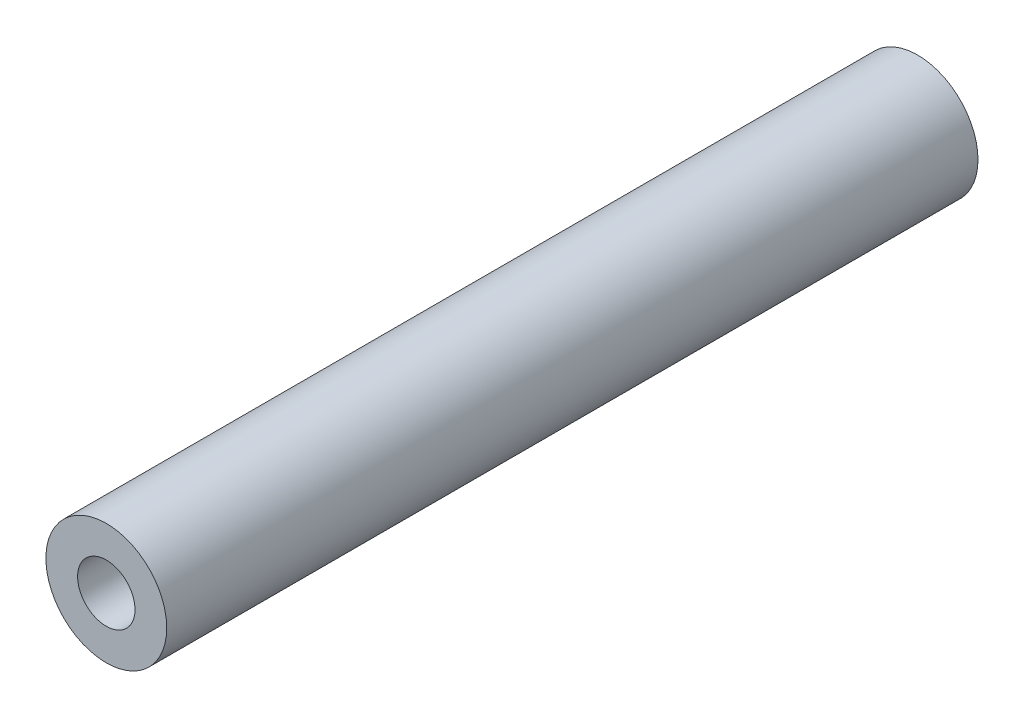
ISO-10303-21;
HEADER;
FILE_DESCRIPTION(('STEP AP214'),'2;1');
FILE_NAME('part.step','',(''),(''),'','','');
FILE_SCHEMA(('AUTOMOTIVE_DESIGN { 1 0 10303 214 1 1 1 1 }'));
ENDSEC;
DATA;
#1=APPLICATION_CONTEXT('core data for automotive mechanical design processes');
#2=APPLICATION_PROTOCOL_DEFINITION('international standard','automotive_design',2000,#1);
#3=PRODUCT_CONTEXT('',#1,'mechanical');
#4=PRODUCT('Part','Part','',(#3));
#5=PRODUCT_RELATED_PRODUCT_CATEGORY('part','',(#4));
#6=PRODUCT_DEFINITION_FORMATION('','',#4);
#7=PRODUCT_DEFINITION_CONTEXT('part definition',#1,'design');
#8=PRODUCT_DEFINITION('design','',#6,#7);
#9=PRODUCT_DEFINITION_SHAPE('','',#8);
#10=(LENGTH_UNIT() NAMED_UNIT(*) SI_UNIT(.MILLI.,.METRE.));
#11=(NAMED_UNIT(*) PLANE_ANGLE_UNIT() SI_UNIT($,.RADIAN.));
#12=(NAMED_UNIT(*) SI_UNIT($,.STERADIAN.) SOLID_ANGLE_UNIT());
#13=UNCERTAINTY_MEASURE_WITH_UNIT(LENGTH_MEASURE(1.E-05),#10,'distance_accuracy_value','');
#14=(GEOMETRIC_REPRESENTATION_CONTEXT(3) GLOBAL_UNCERTAINTY_ASSIGNED_CONTEXT((#13)) GLOBAL_UNIT_ASSIGNED_CONTEXT((#10,
#11,#12)) REPRESENTATION_CONTEXT('',''));
#15=CARTESIAN_POINT('',(0.,0.,0.));
#16=DIRECTION('',(0.,0.,1.));
#17=DIRECTION('',(1.,0.,0.));
#18=AXIS2_PLACEMENT_3D('',#15,#16,#17);
#19=CARTESIAN_POINT('',(0.,0.,94.));
#20=DIRECTION('',(0.,0.,1.));
#21=DIRECTION('',(1.,0.,0.));
#22=AXIS2_PLACEMENT_3D('',#19,#20,#21);
#23=PLANE('',#22);
#24=CARTESIAN_POINT('',(0.,0.,94.));
#25=DIRECTION('',(0.,0.,1.));
#26=DIRECTION('',(1.,0.,0.));
#27=AXIS2_PLACEMENT_3D('',#24,#25,#26);
#28=CIRCLE('',#27,7.);
#29=CARTESIAN_POINT('',(7.,0.,94.));
#30=VERTEX_POINT('',#29);
#31=EDGE_CURVE('E10',#30,#30,#28,.T.);
#32=ORIENTED_EDGE('',*,*,#31,.T.);
#33=EDGE_LOOP('',(#32));
#34=FACE_BOUND('',#33,.T.);
#35=CARTESIAN_POINT('',(0.,0.,94.));
#36=DIRECTION('',(0.,0.,1.));
#37=DIRECTION('',(1.,0.,0.));
#38=AXIS2_PLACEMENT_3D('',#35,#36,#37);
#39=CIRCLE('',#38,3.325);
#40=CARTESIAN_POINT('',(3.325,0.,94.));
#41=VERTEX_POINT('',#40);
#42=EDGE_CURVE('E48',#41,#41,#39,.T.);
#43=ORIENTED_EDGE('',*,*,#42,.F.);
#44=EDGE_LOOP('',(#43));
#45=FACE_BOUND('',#44,.T.);
#46=ADVANCED_FACE('F40',(#34,#45),#23,.T.);
#47=CARTESIAN_POINT('',(0.,0.,0.));
#48=DIRECTION('',(0.,0.,1.));
#49=DIRECTION('',(1.,0.,0.));
#50=AXIS2_PLACEMENT_3D('',#47,#48,#49);
#51=PLANE('',#50);
#52=CARTESIAN_POINT('',(0.,0.,0.));
#53=DIRECTION('',(0.,0.,1.));
#54=DIRECTION('',(1.,0.,0.));
#55=AXIS2_PLACEMENT_3D('',#52,#53,#54);
#56=CIRCLE('',#55,7.);
#57=CARTESIAN_POINT('',(7.,0.,0.));
#58=VERTEX_POINT('',#57);
#59=EDGE_CURVE('E41',#58,#58,#56,.T.);
#60=ORIENTED_EDGE('',*,*,#59,.F.);
#61=EDGE_LOOP('',(#60));
#62=FACE_BOUND('',#61,.T.);
#63=CARTESIAN_POINT('',(0.,0.,0.));
#64=DIRECTION('',(0.,0.,1.));
#65=DIRECTION('',(1.,0.,0.));
#66=AXIS2_PLACEMENT_3D('',#63,#64,#65);
#67=CIRCLE('',#66,3.325);
#68=CARTESIAN_POINT('',(3.325,0.,0.));
#69=VERTEX_POINT('',#68);
#70=EDGE_CURVE('E49',#69,#69,#67,.T.);
#71=ORIENTED_EDGE('',*,*,#70,.T.);
#72=EDGE_LOOP('',(#71));
#73=FACE_BOUND('',#72,.T.);
#74=ADVANCED_FACE('F58',(#62,#73),#51,.F.);
#75=CARTESIAN_POINT('',(0.,0.,94.));
#76=DIRECTION('',(0.,0.,-1.));
#77=DIRECTION('',(-1.,0.,0.));
#78=AXIS2_PLACEMENT_3D('',#75,#76,#77);
#79=CYLINDRICAL_SURFACE('',#78,7.);
#80=ORIENTED_EDGE('',*,*,#31,.F.);
#81=EDGE_LOOP('',(#80));
#82=FACE_BOUND('',#81,.T.);
#83=ORIENTED_EDGE('',*,*,#59,.T.);
#84=EDGE_LOOP('',(#83));
#85=FACE_BOUND('',#84,.T.);
#86=ADVANCED_FACE('F39',(#82,#85),#79,.T.);
#87=CARTESIAN_POINT('',(0.,0.,94.));
#88=DIRECTION('',(0.,0.,-1.));
#89=DIRECTION('',(-1.,0.,0.));
#90=AXIS2_PLACEMENT_3D('',#87,#88,#89);
#91=CYLINDRICAL_SURFACE('',#90,3.325);
#92=ORIENTED_EDGE('',*,*,#42,.T.);
#93=EDGE_LOOP('',(#92));
#94=FACE_BOUND('',#93,.T.);
#95=ORIENTED_EDGE('',*,*,#70,.F.);
#96=EDGE_LOOP('',(#95));
#97=FACE_BOUND('',#96,.T.);
#98=ADVANCED_FACE('F57',(#94,#97),#91,.F.);
#99=CLOSED_SHELL('',(#46,#74,#86,#98));
#100=MANIFOLD_SOLID_BREP('B2',#99);
#101=ADVANCED_BREP_SHAPE_REPRESENTATION('',(#18,#100),#14);
#102=SHAPE_DEFINITION_REPRESENTATION(#9,#101);
ENDSEC;
END-ISO-10303-21;
